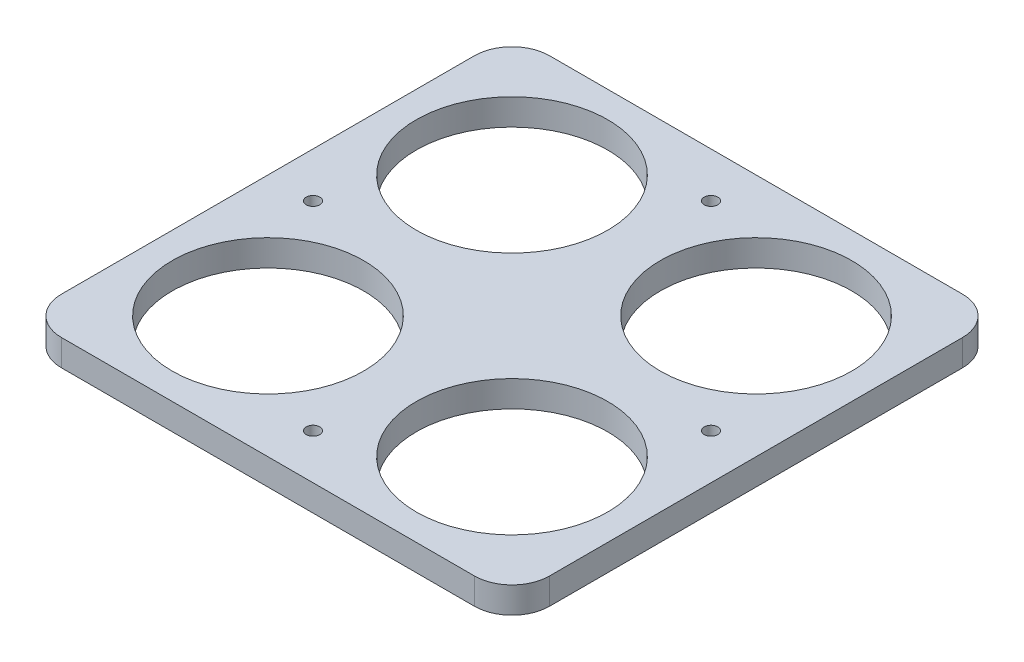
ISO-10303-21;
HEADER;
FILE_DESCRIPTION(('STEP AP214'),'2;1');
FILE_NAME('part.step','',(''),(''),'','','');
FILE_SCHEMA(('AUTOMOTIVE_DESIGN { 1 0 10303 214 1 1 1 1 }'));
ENDSEC;
DATA;
#1=APPLICATION_CONTEXT('core data for automotive mechanical design processes');
#2=APPLICATION_PROTOCOL_DEFINITION('international standard','automotive_design',2000,#1);
#3=PRODUCT_CONTEXT('',#1,'mechanical');
#4=PRODUCT('Part','Part','',(#3));
#5=PRODUCT_RELATED_PRODUCT_CATEGORY('part','',(#4));
#6=PRODUCT_DEFINITION_FORMATION('','',#4);
#7=PRODUCT_DEFINITION_CONTEXT('part definition',#1,'design');
#8=PRODUCT_DEFINITION('design','',#6,#7);
#9=PRODUCT_DEFINITION_SHAPE('','',#8);
#10=(LENGTH_UNIT() NAMED_UNIT(*) SI_UNIT(.MILLI.,.METRE.));
#11=(NAMED_UNIT(*) PLANE_ANGLE_UNIT() SI_UNIT($,.RADIAN.));
#12=(NAMED_UNIT(*) SI_UNIT($,.STERADIAN.) SOLID_ANGLE_UNIT());
#13=UNCERTAINTY_MEASURE_WITH_UNIT(LENGTH_MEASURE(1.E-05),#10,'distance_accuracy_value','');
#14=(GEOMETRIC_REPRESENTATION_CONTEXT(3) GLOBAL_UNCERTAINTY_ASSIGNED_CONTEXT((#13)) GLOBAL_UNIT_ASSIGNED_CONTEXT((#10,
#11,#12)) REPRESENTATION_CONTEXT('',''));
#15=CARTESIAN_POINT('',(0.,0.,0.));
#16=DIRECTION('',(0.,0.,1.));
#17=DIRECTION('',(1.,0.,0.));
#18=AXIS2_PLACEMENT_3D('',#15,#16,#17);
#19=CARTESIAN_POINT('',(0.,7.,0.));
#20=DIRECTION('',(0.,-1.,0.));
#21=DIRECTION('',(0.,0.,-1.));
#22=AXIS2_PLACEMENT_3D('',#19,#20,#21);
#23=PLANE('',#22);
#24=DIRECTION('',(-1.,0.,0.));
#25=VECTOR('',#24,1.);
#26=CARTESIAN_POINT('',(-65.,7.,-65.));
#27=LINE('',#26,#25);
#28=CARTESIAN_POINT('',(55.,7.,-65.));
#29=VERTEX_POINT('',#28);
#30=CARTESIAN_POINT('',(-55.,7.,-65.));
#31=VERTEX_POINT('',#30);
#32=EDGE_CURVE('E146',#29,#31,#27,.T.);
#33=ORIENTED_EDGE('',*,*,#32,.T.);
#34=CARTESIAN_POINT('',(-55.,7.,-55.));
#35=DIRECTION('',(0.,-1.,0.));
#36=DIRECTION('',(0.,0.,-1.));
#37=AXIS2_PLACEMENT_3D('',#34,#35,#36);
#38=CIRCLE('',#37,10.);
#39=CARTESIAN_POINT('',(-65.,7.,-55.));
#40=VERTEX_POINT('',#39);
#41=EDGE_CURVE('E165',#31,#40,#38,.F.);
#42=ORIENTED_EDGE('',*,*,#41,.T.);
#43=DIRECTION('',(0.,0.,1.));
#44=VECTOR('',#43,1.);
#45=CARTESIAN_POINT('',(-65.,7.,65.));
#46=LINE('',#45,#44);
#47=CARTESIAN_POINT('',(-65.,7.,55.));
#48=VERTEX_POINT('',#47);
#49=EDGE_CURVE('E129',#40,#48,#46,.T.);
#50=ORIENTED_EDGE('',*,*,#49,.T.);
#51=CARTESIAN_POINT('',(-55.,7.,55.));
#52=DIRECTION('',(0.,-1.,0.));
#53=DIRECTION('',(0.,0.,-1.));
#54=AXIS2_PLACEMENT_3D('',#51,#52,#53);
#55=CIRCLE('',#54,10.);
#56=CARTESIAN_POINT('',(-55.,7.,65.));
#57=VERTEX_POINT('',#56);
#58=EDGE_CURVE('E160',#48,#57,#55,.F.);
#59=ORIENTED_EDGE('',*,*,#58,.T.);
#60=DIRECTION('',(1.,0.,0.));
#61=VECTOR('',#60,1.);
#62=CARTESIAN_POINT('',(-65.,7.,65.));
#63=LINE('',#62,#61);
#64=CARTESIAN_POINT('',(55.,7.,65.));
#65=VERTEX_POINT('',#64);
#66=EDGE_CURVE('E176',#57,#65,#63,.T.);
#67=ORIENTED_EDGE('',*,*,#66,.T.);
#68=CARTESIAN_POINT('',(55.,7.,55.));
#69=DIRECTION('',(0.,-1.,0.));
#70=DIRECTION('',(0.,0.,-1.));
#71=AXIS2_PLACEMENT_3D('',#68,#69,#70);
#72=CIRCLE('',#71,10.);
#73=CARTESIAN_POINT('',(65.,7.,55.));
#74=VERTEX_POINT('',#73);
#75=EDGE_CURVE('E65',#65,#74,#72,.F.);
#76=ORIENTED_EDGE('',*,*,#75,.T.);
#77=DIRECTION('',(0.,0.,-1.));
#78=VECTOR('',#77,1.);
#79=CARTESIAN_POINT('',(65.,7.,65.));
#80=LINE('',#79,#78);
#81=CARTESIAN_POINT('',(65.,7.,-55.));
#82=VERTEX_POINT('',#81);
#83=EDGE_CURVE('E184',#74,#82,#80,.T.);
#84=ORIENTED_EDGE('',*,*,#83,.T.);
#85=CARTESIAN_POINT('',(55.,7.,-55.));
#86=DIRECTION('',(0.,-1.,0.));
#87=DIRECTION('',(0.,0.,-1.));
#88=AXIS2_PLACEMENT_3D('',#85,#86,#87);
#89=CIRCLE('',#88,10.);
#90=EDGE_CURVE('E163',#82,#29,#89,.F.);
#91=ORIENTED_EDGE('',*,*,#90,.T.);
#92=EDGE_LOOP('',(#33,#42,#50,#59,#67,#76,#84,#91));
#93=FACE_BOUND('',#92,.T.);
#94=CARTESIAN_POINT('',(-32.5,7.,-32.5));
#95=DIRECTION('',(0.,1.,0.));
#96=DIRECTION('',(0.,0.,1.));
#97=AXIS2_PLACEMENT_3D('',#94,#95,#96);
#98=CIRCLE('',#97,25.5);
#99=CARTESIAN_POINT('',(-32.5,7.,-6.99999999999997));
#100=VERTEX_POINT('',#99);
#101=EDGE_CURVE('E137',#100,#100,#98,.T.);
#102=ORIENTED_EDGE('',*,*,#101,.F.);
#103=EDGE_LOOP('',(#102));
#104=FACE_BOUND('',#103,.T.);
#105=CARTESIAN_POINT('',(32.5,7.,-32.5));
#106=DIRECTION('',(0.,1.,0.));
#107=DIRECTION('',(0.,0.,1.));
#108=AXIS2_PLACEMENT_3D('',#105,#106,#107);
#109=CIRCLE('',#108,25.5);
#110=CARTESIAN_POINT('',(32.5,7.,-6.99999999999998));
#111=VERTEX_POINT('',#110);
#112=EDGE_CURVE('E191',#111,#111,#109,.T.);
#113=ORIENTED_EDGE('',*,*,#112,.F.);
#114=EDGE_LOOP('',(#113));
#115=FACE_BOUND('',#114,.T.);
#116=CARTESIAN_POINT('',(-32.5,7.,32.5));
#117=DIRECTION('',(0.,1.,0.));
#118=DIRECTION('',(0.,0.,1.));
#119=AXIS2_PLACEMENT_3D('',#116,#117,#118);
#120=CIRCLE('',#119,25.5);
#121=CARTESIAN_POINT('',(-32.5,7.,58.));
#122=VERTEX_POINT('',#121);
#123=EDGE_CURVE('E196',#122,#122,#120,.T.);
#124=ORIENTED_EDGE('',*,*,#123,.F.);
#125=EDGE_LOOP('',(#124));
#126=FACE_BOUND('',#125,.T.);
#127=CARTESIAN_POINT('',(32.5,7.,32.5));
#128=DIRECTION('',(0.,1.,0.));
#129=DIRECTION('',(0.,0.,1.));
#130=AXIS2_PLACEMENT_3D('',#127,#128,#129);
#131=CIRCLE('',#130,25.5);
#132=CARTESIAN_POINT('',(32.5,7.,58.));
#133=VERTEX_POINT('',#132);
#134=EDGE_CURVE('E202',#133,#133,#131,.T.);
#135=ORIENTED_EDGE('',*,*,#134,.F.);
#136=EDGE_LOOP('',(#135));
#137=FACE_BOUND('',#136,.T.);
#138=CARTESIAN_POINT('',(0.,7.,53.));
#139=DIRECTION('',(0.,1.,0.));
#140=DIRECTION('',(0.,0.,1.));
#141=AXIS2_PLACEMENT_3D('',#138,#139,#140);
#142=CIRCLE('',#141,1.8);
#143=CARTESIAN_POINT('',(0.,7.,54.8));
#144=VERTEX_POINT('',#143);
#145=EDGE_CURVE('E208',#144,#144,#142,.T.);
#146=ORIENTED_EDGE('',*,*,#145,.F.);
#147=EDGE_LOOP('',(#146));
#148=FACE_BOUND('',#147,.T.);
#149=CARTESIAN_POINT('',(-53.,7.,0.));
#150=DIRECTION('',(0.,1.,0.));
#151=DIRECTION('',(0.,0.,1.));
#152=AXIS2_PLACEMENT_3D('',#149,#150,#151);
#153=CIRCLE('',#152,1.8);
#154=CARTESIAN_POINT('',(-53.,7.,1.80000000000001));
#155=VERTEX_POINT('',#154);
#156=EDGE_CURVE('E214',#155,#155,#153,.T.);
#157=ORIENTED_EDGE('',*,*,#156,.F.);
#158=EDGE_LOOP('',(#157));
#159=FACE_BOUND('',#158,.T.);
#160=CARTESIAN_POINT('',(0.,7.,-53.));
#161=DIRECTION('',(0.,1.,0.));
#162=DIRECTION('',(0.,0.,-1.));
#163=AXIS2_PLACEMENT_3D('',#160,#161,#162);
#164=CIRCLE('',#163,1.8);
#165=CARTESIAN_POINT('',(0.,7.,-54.8));
#166=VERTEX_POINT('',#165);
#167=EDGE_CURVE('E220',#166,#166,#164,.T.);
#168=ORIENTED_EDGE('',*,*,#167,.F.);
#169=EDGE_LOOP('',(#168));
#170=FACE_BOUND('',#169,.T.);
#171=CARTESIAN_POINT('',(53.,7.,0.));
#172=DIRECTION('',(0.,1.,0.));
#173=DIRECTION('',(0.,0.,-1.));
#174=AXIS2_PLACEMENT_3D('',#171,#172,#173);
#175=CIRCLE('',#174,1.8);
#176=CARTESIAN_POINT('',(53.,7.,-1.79999999999999));
#177=VERTEX_POINT('',#176);
#178=EDGE_CURVE('E226',#177,#177,#175,.T.);
#179=ORIENTED_EDGE('',*,*,#178,.F.);
#180=EDGE_LOOP('',(#179));
#181=FACE_BOUND('',#180,.T.);
#182=ADVANCED_FACE('F43',(#93,#104,#115,#126,#137,#148,#159,#170,#181),#23,.F.);
#183=CARTESIAN_POINT('',(0.,0.,0.));
#184=DIRECTION('',(0.,-1.,0.));
#185=DIRECTION('',(0.,0.,-1.));
#186=AXIS2_PLACEMENT_3D('',#183,#184,#185);
#187=PLANE('',#186);
#188=CARTESIAN_POINT('',(0.,0.,-53.));
#189=DIRECTION('',(0.,1.,0.));
#190=DIRECTION('',(0.,0.,-1.));
#191=AXIS2_PLACEMENT_3D('',#188,#189,#190);
#192=CIRCLE('',#191,1.8);
#193=CARTESIAN_POINT('',(0.,0.,-54.8));
#194=VERTEX_POINT('',#193);
#195=EDGE_CURVE('E223',#194,#194,#192,.T.);
#196=ORIENTED_EDGE('',*,*,#195,.T.);
#197=EDGE_LOOP('',(#196));
#198=FACE_BOUND('',#197,.T.);
#199=CARTESIAN_POINT('',(0.,0.,53.));
#200=DIRECTION('',(0.,1.,0.));
#201=DIRECTION('',(0.,0.,1.));
#202=AXIS2_PLACEMENT_3D('',#199,#200,#201);
#203=CIRCLE('',#202,1.8);
#204=CARTESIAN_POINT('',(0.,0.,54.8));
#205=VERTEX_POINT('',#204);
#206=EDGE_CURVE('E211',#205,#205,#203,.T.);
#207=ORIENTED_EDGE('',*,*,#206,.T.);
#208=EDGE_LOOP('',(#207));
#209=FACE_BOUND('',#208,.T.);
#210=CARTESIAN_POINT('',(-32.5,0.,32.5));
#211=DIRECTION('',(0.,1.,0.));
#212=DIRECTION('',(0.,0.,1.));
#213=AXIS2_PLACEMENT_3D('',#210,#211,#212);
#214=CIRCLE('',#213,25.5);
#215=CARTESIAN_POINT('',(-32.5,0.,58.));
#216=VERTEX_POINT('',#215);
#217=EDGE_CURVE('E199',#216,#216,#214,.T.);
#218=ORIENTED_EDGE('',*,*,#217,.T.);
#219=EDGE_LOOP('',(#218));
#220=FACE_BOUND('',#219,.T.);
#221=CARTESIAN_POINT('',(-32.5,0.,-32.5));
#222=DIRECTION('',(0.,1.,0.));
#223=DIRECTION('',(0.,0.,1.));
#224=AXIS2_PLACEMENT_3D('',#221,#222,#223);
#225=CIRCLE('',#224,25.5);
#226=CARTESIAN_POINT('',(-32.5,0.,-6.99999999999997));
#227=VERTEX_POINT('',#226);
#228=EDGE_CURVE('E143',#227,#227,#225,.T.);
#229=ORIENTED_EDGE('',*,*,#228,.T.);
#230=EDGE_LOOP('',(#229));
#231=FACE_BOUND('',#230,.T.);
#232=DIRECTION('',(0.,0.,1.));
#233=VECTOR('',#232,1.);
#234=CARTESIAN_POINT('',(-65.,0.,65.));
#235=LINE('',#234,#233);
#236=CARTESIAN_POINT('',(-65.,0.,-55.));
#237=VERTEX_POINT('',#236);
#238=CARTESIAN_POINT('',(-65.,0.,55.));
#239=VERTEX_POINT('',#238);
#240=EDGE_CURVE('E126',#237,#239,#235,.T.);
#241=ORIENTED_EDGE('',*,*,#240,.F.);
#242=CARTESIAN_POINT('',(-55.,0.,-55.));
#243=DIRECTION('',(0.,-1.,0.));
#244=DIRECTION('',(0.,0.,-1.));
#245=AXIS2_PLACEMENT_3D('',#242,#243,#244);
#246=CIRCLE('',#245,10.);
#247=CARTESIAN_POINT('',(-55.,0.,-65.));
#248=VERTEX_POINT('',#247);
#249=EDGE_CURVE('E109',#237,#248,#246,.T.);
#250=ORIENTED_EDGE('',*,*,#249,.T.);
#251=DIRECTION('',(-1.,0.,0.));
#252=VECTOR('',#251,1.);
#253=CARTESIAN_POINT('',(-65.,0.,-65.));
#254=LINE('',#253,#252);
#255=CARTESIAN_POINT('',(55.,0.,-65.));
#256=VERTEX_POINT('',#255);
#257=EDGE_CURVE('E150',#256,#248,#254,.T.);
#258=ORIENTED_EDGE('',*,*,#257,.F.);
#259=CARTESIAN_POINT('',(55.,0.,-55.));
#260=DIRECTION('',(0.,-1.,0.));
#261=DIRECTION('',(0.,0.,-1.));
#262=AXIS2_PLACEMENT_3D('',#259,#260,#261);
#263=CIRCLE('',#262,10.);
#264=CARTESIAN_POINT('',(65.,0.,-55.));
#265=VERTEX_POINT('',#264);
#266=EDGE_CURVE('E120',#256,#265,#263,.T.);
#267=ORIENTED_EDGE('',*,*,#266,.T.);
#268=DIRECTION('',(0.,0.,-1.));
#269=VECTOR('',#268,1.);
#270=CARTESIAN_POINT('',(65.,0.,65.));
#271=LINE('',#270,#269);
#272=CARTESIAN_POINT('',(65.,0.,55.));
#273=VERTEX_POINT('',#272);
#274=EDGE_CURVE('E140',#273,#265,#271,.T.);
#275=ORIENTED_EDGE('',*,*,#274,.F.);
#276=CARTESIAN_POINT('',(55.,0.,55.));
#277=DIRECTION('',(0.,-1.,0.));
#278=DIRECTION('',(0.,0.,-1.));
#279=AXIS2_PLACEMENT_3D('',#276,#277,#278);
#280=CIRCLE('',#279,10.);
#281=CARTESIAN_POINT('',(55.,0.,65.));
#282=VERTEX_POINT('',#281);
#283=EDGE_CURVE('E154',#273,#282,#280,.T.);
#284=ORIENTED_EDGE('',*,*,#283,.T.);
#285=DIRECTION('',(1.,0.,0.));
#286=VECTOR('',#285,1.);
#287=CARTESIAN_POINT('',(-65.,0.,65.));
#288=LINE('',#287,#286);
#289=CARTESIAN_POINT('',(-55.,0.,65.));
#290=VERTEX_POINT('',#289);
#291=EDGE_CURVE('E136',#290,#282,#288,.T.);
#292=ORIENTED_EDGE('',*,*,#291,.F.);
#293=CARTESIAN_POINT('',(-55.,0.,55.));
#294=DIRECTION('',(0.,-1.,0.));
#295=DIRECTION('',(0.,0.,-1.));
#296=AXIS2_PLACEMENT_3D('',#293,#294,#295);
#297=CIRCLE('',#296,10.);
#298=EDGE_CURVE('E130',#290,#239,#297,.T.);
#299=ORIENTED_EDGE('',*,*,#298,.T.);
#300=EDGE_LOOP('',(#241,#250,#258,#267,#275,#284,#292,#299));
#301=FACE_BOUND('',#300,.T.);
#302=CARTESIAN_POINT('',(32.5,0.,-32.5));
#303=DIRECTION('',(0.,1.,0.));
#304=DIRECTION('',(0.,0.,1.));
#305=AXIS2_PLACEMENT_3D('',#302,#303,#304);
#306=CIRCLE('',#305,25.5);
#307=CARTESIAN_POINT('',(32.5,0.,-6.99999999999998));
#308=VERTEX_POINT('',#307);
#309=EDGE_CURVE('E193',#308,#308,#306,.T.);
#310=ORIENTED_EDGE('',*,*,#309,.T.);
#311=EDGE_LOOP('',(#310));
#312=FACE_BOUND('',#311,.T.);
#313=CARTESIAN_POINT('',(32.5,0.,32.5));
#314=DIRECTION('',(0.,1.,0.));
#315=DIRECTION('',(0.,0.,1.));
#316=AXIS2_PLACEMENT_3D('',#313,#314,#315);
#317=CIRCLE('',#316,25.5);
#318=CARTESIAN_POINT('',(32.5,0.,58.));
#319=VERTEX_POINT('',#318);
#320=EDGE_CURVE('E205',#319,#319,#317,.T.);
#321=ORIENTED_EDGE('',*,*,#320,.T.);
#322=EDGE_LOOP('',(#321));
#323=FACE_BOUND('',#322,.T.);
#324=CARTESIAN_POINT('',(-53.,0.,0.));
#325=DIRECTION('',(0.,1.,0.));
#326=DIRECTION('',(0.,0.,1.));
#327=AXIS2_PLACEMENT_3D('',#324,#325,#326);
#328=CIRCLE('',#327,1.8);
#329=CARTESIAN_POINT('',(-53.,0.,1.80000000000001));
#330=VERTEX_POINT('',#329);
#331=EDGE_CURVE('E217',#330,#330,#328,.T.);
#332=ORIENTED_EDGE('',*,*,#331,.T.);
#333=EDGE_LOOP('',(#332));
#334=FACE_BOUND('',#333,.T.);
#335=CARTESIAN_POINT('',(53.,0.,0.));
#336=DIRECTION('',(0.,1.,0.));
#337=DIRECTION('',(0.,0.,-1.));
#338=AXIS2_PLACEMENT_3D('',#335,#336,#337);
#339=CIRCLE('',#338,1.8);
#340=CARTESIAN_POINT('',(53.,0.,-1.79999999999999));
#341=VERTEX_POINT('',#340);
#342=EDGE_CURVE('E229',#341,#341,#339,.T.);
#343=ORIENTED_EDGE('',*,*,#342,.T.);
#344=EDGE_LOOP('',(#343));
#345=FACE_BOUND('',#344,.T.);
#346=ADVANCED_FACE('F133',(#198,#209,#220,#231,#301,#312,#323,#334,#345),#187,.T.);
#347=CARTESIAN_POINT('',(-65.,7.,65.));
#348=DIRECTION('',(1.,0.,0.));
#349=DIRECTION('',(0.,0.,-1.));
#350=AXIS2_PLACEMENT_3D('',#347,#348,#349);
#351=PLANE('',#350);
#352=ORIENTED_EDGE('',*,*,#49,.F.);
#353=DIRECTION('',(0.,-1.,0.));
#354=VECTOR('',#353,1.);
#355=CARTESIAN_POINT('',(-65.,7.,-55.));
#356=LINE('',#355,#354);
#357=EDGE_CURVE('E113',#40,#237,#356,.T.);
#358=ORIENTED_EDGE('',*,*,#357,.T.);
#359=ORIENTED_EDGE('',*,*,#240,.T.);
#360=DIRECTION('',(0.,-1.,0.));
#361=VECTOR('',#360,1.);
#362=CARTESIAN_POINT('',(-65.,7.,55.));
#363=LINE('',#362,#361);
#364=EDGE_CURVE('E131',#239,#48,#363,.F.);
#365=ORIENTED_EDGE('',*,*,#364,.T.);
#366=EDGE_LOOP('',(#352,#358,#359,#365));
#367=FACE_BOUND('',#366,.T.);
#368=ADVANCED_FACE('F125',(#367),#351,.F.);
#369=CARTESIAN_POINT('',(-65.,7.,65.));
#370=DIRECTION('',(0.,0.,-1.));
#371=DIRECTION('',(-1.,0.,0.));
#372=AXIS2_PLACEMENT_3D('',#369,#370,#371);
#373=PLANE('',#372);
#374=ORIENTED_EDGE('',*,*,#291,.T.);
#375=DIRECTION('',(0.,-1.,0.));
#376=VECTOR('',#375,1.);
#377=CARTESIAN_POINT('',(55.,7.,65.));
#378=LINE('',#377,#376);
#379=EDGE_CURVE('E11',#282,#65,#378,.F.);
#380=ORIENTED_EDGE('',*,*,#379,.T.);
#381=ORIENTED_EDGE('',*,*,#66,.F.);
#382=DIRECTION('',(0.,-1.,0.));
#383=VECTOR('',#382,1.);
#384=CARTESIAN_POINT('',(-55.,7.,65.));
#385=LINE('',#384,#383);
#386=EDGE_CURVE('E51',#57,#290,#385,.T.);
#387=ORIENTED_EDGE('',*,*,#386,.T.);
#388=EDGE_LOOP('',(#374,#380,#381,#387));
#389=FACE_BOUND('',#388,.T.);
#390=ADVANCED_FACE('F174',(#389),#373,.F.);
#391=CARTESIAN_POINT('',(65.,7.,65.));
#392=DIRECTION('',(-1.,0.,0.));
#393=DIRECTION('',(0.,0.,1.));
#394=AXIS2_PLACEMENT_3D('',#391,#392,#393);
#395=PLANE('',#394);
#396=ORIENTED_EDGE('',*,*,#274,.T.);
#397=DIRECTION('',(0.,-1.,0.));
#398=VECTOR('',#397,1.);
#399=CARTESIAN_POINT('',(65.,7.,-55.));
#400=LINE('',#399,#398);
#401=EDGE_CURVE('E58',#265,#82,#400,.F.);
#402=ORIENTED_EDGE('',*,*,#401,.T.);
#403=ORIENTED_EDGE('',*,*,#83,.F.);
#404=DIRECTION('',(0.,-1.,0.));
#405=VECTOR('',#404,1.);
#406=CARTESIAN_POINT('',(65.,7.,55.));
#407=LINE('',#406,#405);
#408=EDGE_CURVE('E167',#74,#273,#407,.T.);
#409=ORIENTED_EDGE('',*,*,#408,.T.);
#410=EDGE_LOOP('',(#396,#402,#403,#409));
#411=FACE_BOUND('',#410,.T.);
#412=ADVANCED_FACE('F183',(#411),#395,.F.);
#413=CARTESIAN_POINT('',(-65.,7.,-65.));
#414=DIRECTION('',(0.,0.,1.));
#415=DIRECTION('',(1.,0.,0.));
#416=AXIS2_PLACEMENT_3D('',#413,#414,#415);
#417=PLANE('',#416);
#418=ORIENTED_EDGE('',*,*,#257,.T.);
#419=DIRECTION('',(0.,-1.,0.));
#420=VECTOR('',#419,1.);
#421=CARTESIAN_POINT('',(-55.,7.,-65.));
#422=LINE('',#421,#420);
#423=EDGE_CURVE('E114',#248,#31,#422,.F.);
#424=ORIENTED_EDGE('',*,*,#423,.T.);
#425=ORIENTED_EDGE('',*,*,#32,.F.);
#426=DIRECTION('',(0.,-1.,0.));
#427=VECTOR('',#426,1.);
#428=CARTESIAN_POINT('',(55.,7.,-65.));
#429=LINE('',#428,#427);
#430=EDGE_CURVE('E119',#29,#256,#429,.T.);
#431=ORIENTED_EDGE('',*,*,#430,.T.);
#432=EDGE_LOOP('',(#418,#424,#425,#431));
#433=FACE_BOUND('',#432,.T.);
#434=ADVANCED_FACE('F251',(#433),#417,.F.);
#435=CARTESIAN_POINT('',(-32.5,7.,-32.5));
#436=DIRECTION('',(0.,-1.,0.));
#437=DIRECTION('',(0.,0.,-1.));
#438=AXIS2_PLACEMENT_3D('',#435,#436,#437);
#439=CYLINDRICAL_SURFACE('',#438,25.5);
#440=ORIENTED_EDGE('',*,*,#101,.T.);
#441=EDGE_LOOP('',(#440));
#442=FACE_BOUND('',#441,.T.);
#443=ORIENTED_EDGE('',*,*,#228,.F.);
#444=EDGE_LOOP('',(#443));
#445=FACE_BOUND('',#444,.T.);
#446=ADVANCED_FACE('F248',(#442,#445),#439,.F.);
#447=CARTESIAN_POINT('',(32.5,7.,-32.5));
#448=DIRECTION('',(0.,-1.,0.));
#449=DIRECTION('',(0.,0.,-1.));
#450=AXIS2_PLACEMENT_3D('',#447,#448,#449);
#451=CYLINDRICAL_SURFACE('',#450,25.5);
#452=ORIENTED_EDGE('',*,*,#112,.T.);
#453=EDGE_LOOP('',(#452));
#454=FACE_BOUND('',#453,.T.);
#455=ORIENTED_EDGE('',*,*,#309,.F.);
#456=EDGE_LOOP('',(#455));
#457=FACE_BOUND('',#456,.T.);
#458=ADVANCED_FACE('F348',(#454,#457),#451,.F.);
#459=CARTESIAN_POINT('',(-32.5,7.,32.5));
#460=DIRECTION('',(0.,-1.,0.));
#461=DIRECTION('',(0.,0.,-1.));
#462=AXIS2_PLACEMENT_3D('',#459,#460,#461);
#463=CYLINDRICAL_SURFACE('',#462,25.5);
#464=ORIENTED_EDGE('',*,*,#123,.T.);
#465=EDGE_LOOP('',(#464));
#466=FACE_BOUND('',#465,.T.);
#467=ORIENTED_EDGE('',*,*,#217,.F.);
#468=EDGE_LOOP('',(#467));
#469=FACE_BOUND('',#468,.T.);
#470=ADVANCED_FACE('F338',(#466,#469),#463,.F.);
#471=CARTESIAN_POINT('',(32.5,7.,32.5));
#472=DIRECTION('',(0.,-1.,0.));
#473=DIRECTION('',(0.,0.,-1.));
#474=AXIS2_PLACEMENT_3D('',#471,#472,#473);
#475=CYLINDRICAL_SURFACE('',#474,25.5);
#476=ORIENTED_EDGE('',*,*,#134,.T.);
#477=EDGE_LOOP('',(#476));
#478=FACE_BOUND('',#477,.T.);
#479=ORIENTED_EDGE('',*,*,#320,.F.);
#480=EDGE_LOOP('',(#479));
#481=FACE_BOUND('',#480,.T.);
#482=ADVANCED_FACE('F328',(#478,#481),#475,.F.);
#483=CARTESIAN_POINT('',(0.,7.,53.));
#484=DIRECTION('',(0.,-1.,0.));
#485=DIRECTION('',(0.,0.,-1.));
#486=AXIS2_PLACEMENT_3D('',#483,#484,#485);
#487=CYLINDRICAL_SURFACE('',#486,1.8);
#488=ORIENTED_EDGE('',*,*,#145,.T.);
#489=EDGE_LOOP('',(#488));
#490=FACE_BOUND('',#489,.T.);
#491=ORIENTED_EDGE('',*,*,#206,.F.);
#492=EDGE_LOOP('',(#491));
#493=FACE_BOUND('',#492,.T.);
#494=ADVANCED_FACE('F318',(#490,#493),#487,.F.);
#495=CARTESIAN_POINT('',(-53.,7.,0.));
#496=DIRECTION('',(0.,-1.,0.));
#497=DIRECTION('',(0.,0.,-1.));
#498=AXIS2_PLACEMENT_3D('',#495,#496,#497);
#499=CYLINDRICAL_SURFACE('',#498,1.8);
#500=ORIENTED_EDGE('',*,*,#156,.T.);
#501=EDGE_LOOP('',(#500));
#502=FACE_BOUND('',#501,.T.);
#503=ORIENTED_EDGE('',*,*,#331,.F.);
#504=EDGE_LOOP('',(#503));
#505=FACE_BOUND('',#504,.T.);
#506=ADVANCED_FACE('F308',(#502,#505),#499,.F.);
#507=CARTESIAN_POINT('',(0.,7.,-53.));
#508=DIRECTION('',(0.,-1.,0.));
#509=DIRECTION('',(0.,0.,-1.));
#510=AXIS2_PLACEMENT_3D('',#507,#508,#509);
#511=CYLINDRICAL_SURFACE('',#510,1.8);
#512=ORIENTED_EDGE('',*,*,#167,.T.);
#513=EDGE_LOOP('',(#512));
#514=FACE_BOUND('',#513,.T.);
#515=ORIENTED_EDGE('',*,*,#195,.F.);
#516=EDGE_LOOP('',(#515));
#517=FACE_BOUND('',#516,.T.);
#518=ADVANCED_FACE('F299',(#514,#517),#511,.F.);
#519=CARTESIAN_POINT('',(53.,7.,0.));
#520=DIRECTION('',(0.,-1.,0.));
#521=DIRECTION('',(0.,0.,-1.));
#522=AXIS2_PLACEMENT_3D('',#519,#520,#521);
#523=CYLINDRICAL_SURFACE('',#522,1.8);
#524=ORIENTED_EDGE('',*,*,#178,.T.);
#525=EDGE_LOOP('',(#524));
#526=FACE_BOUND('',#525,.T.);
#527=ORIENTED_EDGE('',*,*,#342,.F.);
#528=EDGE_LOOP('',(#527));
#529=FACE_BOUND('',#528,.T.);
#530=ADVANCED_FACE('F235',(#526,#529),#523,.F.);
#531=CARTESIAN_POINT('',(-55.,7.,-55.));
#532=DIRECTION('',(0.,-1.,0.));
#533=DIRECTION('',(0.,0.,-1.));
#534=AXIS2_PLACEMENT_3D('',#531,#532,#533);
#535=CYLINDRICAL_SURFACE('',#534,10.);
#536=ORIENTED_EDGE('',*,*,#41,.F.);
#537=ORIENTED_EDGE('',*,*,#423,.F.);
#538=ORIENTED_EDGE('',*,*,#249,.F.);
#539=ORIENTED_EDGE('',*,*,#357,.F.);
#540=EDGE_LOOP('',(#536,#537,#538,#539));
#541=FACE_BOUND('',#540,.T.);
#542=ADVANCED_FACE('F112',(#541),#535,.T.);
#543=CARTESIAN_POINT('',(55.,7.,-55.));
#544=DIRECTION('',(0.,-1.,0.));
#545=DIRECTION('',(0.,0.,-1.));
#546=AXIS2_PLACEMENT_3D('',#543,#544,#545);
#547=CYLINDRICAL_SURFACE('',#546,10.);
#548=ORIENTED_EDGE('',*,*,#90,.F.);
#549=ORIENTED_EDGE('',*,*,#401,.F.);
#550=ORIENTED_EDGE('',*,*,#266,.F.);
#551=ORIENTED_EDGE('',*,*,#430,.F.);
#552=EDGE_LOOP('',(#548,#549,#550,#551));
#553=FACE_BOUND('',#552,.T.);
#554=ADVANCED_FACE('F263',(#553),#547,.T.);
#555=CARTESIAN_POINT('',(55.,7.,55.));
#556=DIRECTION('',(0.,-1.,0.));
#557=DIRECTION('',(0.,0.,-1.));
#558=AXIS2_PLACEMENT_3D('',#555,#556,#557);
#559=CYLINDRICAL_SURFACE('',#558,10.);
#560=ORIENTED_EDGE('',*,*,#75,.F.);
#561=ORIENTED_EDGE('',*,*,#379,.F.);
#562=ORIENTED_EDGE('',*,*,#283,.F.);
#563=ORIENTED_EDGE('',*,*,#408,.F.);
#564=EDGE_LOOP('',(#560,#561,#562,#563));
#565=FACE_BOUND('',#564,.T.);
#566=ADVANCED_FACE('F182',(#565),#559,.T.);
#567=CARTESIAN_POINT('',(-55.,7.,55.));
#568=DIRECTION('',(0.,-1.,0.));
#569=DIRECTION('',(0.,0.,-1.));
#570=AXIS2_PLACEMENT_3D('',#567,#568,#569);
#571=CYLINDRICAL_SURFACE('',#570,10.);
#572=ORIENTED_EDGE('',*,*,#58,.F.);
#573=ORIENTED_EDGE('',*,*,#364,.F.);
#574=ORIENTED_EDGE('',*,*,#298,.F.);
#575=ORIENTED_EDGE('',*,*,#386,.F.);
#576=EDGE_LOOP('',(#572,#573,#574,#575));
#577=FACE_BOUND('',#576,.T.);
#578=ADVANCED_FACE('F45',(#577),#571,.T.);
#579=CLOSED_SHELL('',(#182,#346,#368,#390,#412,#434,#446,#458,#470,#482,#494,#506,#518,#530,
#542,#554,#566,#578));
#580=MANIFOLD_SOLID_BREP('B2',#579);
#581=ADVANCED_BREP_SHAPE_REPRESENTATION('',(#18,#580),#14);
#582=SHAPE_DEFINITION_REPRESENTATION(#9,#581);
ENDSEC;
END-ISO-10303-21;
